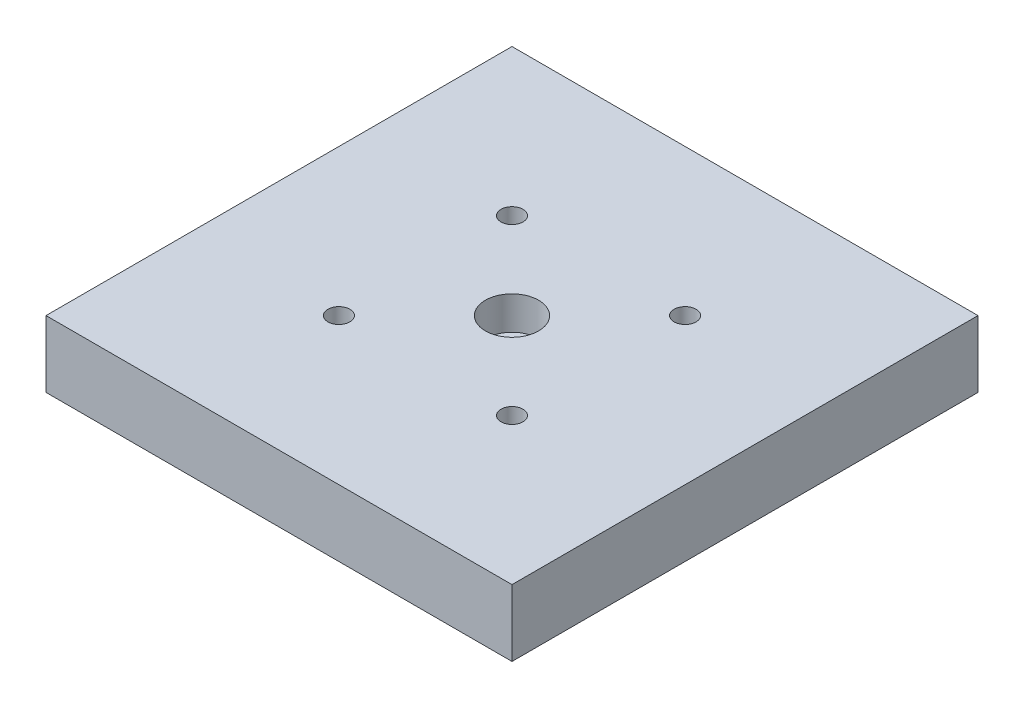
ISO-10303-21;
HEADER;
FILE_DESCRIPTION(('STEP AP214'),'2;1');
FILE_NAME('part.step','',(''),(''),'','','');
FILE_SCHEMA(('AUTOMOTIVE_DESIGN { 1 0 10303 214 1 1 1 1 }'));
ENDSEC;
DATA;
#1=APPLICATION_CONTEXT('core data for automotive mechanical design processes');
#2=APPLICATION_PROTOCOL_DEFINITION('international standard','automotive_design',2000,#1);
#3=PRODUCT_CONTEXT('',#1,'mechanical');
#4=PRODUCT('Part','Part','',(#3));
#5=PRODUCT_RELATED_PRODUCT_CATEGORY('part','',(#4));
#6=PRODUCT_DEFINITION_FORMATION('','',#4);
#7=PRODUCT_DEFINITION_CONTEXT('part definition',#1,'design');
#8=PRODUCT_DEFINITION('design','',#6,#7);
#9=PRODUCT_DEFINITION_SHAPE('','',#8);
#10=(LENGTH_UNIT() NAMED_UNIT(*) SI_UNIT(.MILLI.,.METRE.));
#11=(NAMED_UNIT(*) PLANE_ANGLE_UNIT() SI_UNIT($,.RADIAN.));
#12=(NAMED_UNIT(*) SI_UNIT($,.STERADIAN.) SOLID_ANGLE_UNIT());
#13=UNCERTAINTY_MEASURE_WITH_UNIT(LENGTH_MEASURE(1.E-05),#10,'distance_accuracy_value','');
#14=(GEOMETRIC_REPRESENTATION_CONTEXT(3) GLOBAL_UNCERTAINTY_ASSIGNED_CONTEXT((#13)) GLOBAL_UNIT_ASSIGNED_CONTEXT((#10,
#11,#12)) REPRESENTATION_CONTEXT('',''));
#15=CARTESIAN_POINT('',(0.,0.,0.));
#16=DIRECTION('',(0.,0.,1.));
#17=DIRECTION('',(1.,0.,0.));
#18=AXIS2_PLACEMENT_3D('',#15,#16,#17);
#19=CARTESIAN_POINT('',(35.,10.,35.));
#20=DIRECTION('',(-1.,0.,0.));
#21=DIRECTION('',(0.,0.,1.));
#22=AXIS2_PLACEMENT_3D('',#19,#20,#21);
#23=PLANE('',#22);
#24=DIRECTION('',(0.,0.,-1.));
#25=VECTOR('',#24,1.);
#26=CARTESIAN_POINT('',(35.,0.,35.));
#27=LINE('',#26,#25);
#28=CARTESIAN_POINT('',(35.,0.,35.));
#29=VERTEX_POINT('',#28);
#30=CARTESIAN_POINT('',(35.,0.,-35.));
#31=VERTEX_POINT('',#30);
#32=EDGE_CURVE('E106',#29,#31,#27,.T.);
#33=ORIENTED_EDGE('',*,*,#32,.T.);
#34=DIRECTION('',(0.,-1.,0.));
#35=VECTOR('',#34,1.);
#36=CARTESIAN_POINT('',(35.,10.,-35.));
#37=LINE('',#36,#35);
#38=CARTESIAN_POINT('',(35.,10.,-35.));
#39=VERTEX_POINT('',#38);
#40=EDGE_CURVE('E11',#39,#31,#37,.T.);
#41=ORIENTED_EDGE('',*,*,#40,.F.);
#42=DIRECTION('',(0.,0.,-1.));
#43=VECTOR('',#42,1.);
#44=CARTESIAN_POINT('',(35.,10.,35.));
#45=LINE('',#44,#43);
#46=CARTESIAN_POINT('',(35.,10.,35.));
#47=VERTEX_POINT('',#46);
#48=EDGE_CURVE('E90',#47,#39,#45,.T.);
#49=ORIENTED_EDGE('',*,*,#48,.F.);
#50=DIRECTION('',(0.,-1.,0.));
#51=VECTOR('',#50,1.);
#52=CARTESIAN_POINT('',(35.,10.,35.));
#53=LINE('',#52,#51);
#54=EDGE_CURVE('E102',#47,#29,#53,.T.);
#55=ORIENTED_EDGE('',*,*,#54,.T.);
#56=EDGE_LOOP('',(#33,#41,#49,#55));
#57=FACE_BOUND('',#56,.T.);
#58=ADVANCED_FACE('F38',(#57),#23,.F.);
#59=CARTESIAN_POINT('',(-35.,10.,-35.));
#60=DIRECTION('',(0.,0.,1.));
#61=DIRECTION('',(1.,0.,0.));
#62=AXIS2_PLACEMENT_3D('',#59,#60,#61);
#63=PLANE('',#62);
#64=DIRECTION('',(-1.,0.,0.));
#65=VECTOR('',#64,1.);
#66=CARTESIAN_POINT('',(-35.,0.,-35.));
#67=LINE('',#66,#65);
#68=CARTESIAN_POINT('',(-35.,0.,-35.));
#69=VERTEX_POINT('',#68);
#70=EDGE_CURVE('E95',#31,#69,#67,.T.);
#71=ORIENTED_EDGE('',*,*,#70,.T.);
#72=DIRECTION('',(0.,-1.,0.));
#73=VECTOR('',#72,1.);
#74=CARTESIAN_POINT('',(-35.,10.,-35.));
#75=LINE('',#74,#73);
#76=CARTESIAN_POINT('',(-35.,10.,-35.));
#77=VERTEX_POINT('',#76);
#78=EDGE_CURVE('E47',#77,#69,#75,.T.);
#79=ORIENTED_EDGE('',*,*,#78,.F.);
#80=DIRECTION('',(-1.,0.,0.));
#81=VECTOR('',#80,1.);
#82=CARTESIAN_POINT('',(-35.,10.,-35.));
#83=LINE('',#82,#81);
#84=EDGE_CURVE('E85',#39,#77,#83,.T.);
#85=ORIENTED_EDGE('',*,*,#84,.F.);
#86=ORIENTED_EDGE('',*,*,#40,.T.);
#87=EDGE_LOOP('',(#71,#79,#85,#86));
#88=FACE_BOUND('',#87,.T.);
#89=ADVANCED_FACE('F94',(#88),#63,.F.);
#90=CARTESIAN_POINT('',(-35.,10.,35.));
#91=DIRECTION('',(1.,0.,0.));
#92=DIRECTION('',(0.,0.,-1.));
#93=AXIS2_PLACEMENT_3D('',#90,#91,#92);
#94=PLANE('',#93);
#95=DIRECTION('',(0.,0.,1.));
#96=VECTOR('',#95,1.);
#97=CARTESIAN_POINT('',(-35.,0.,35.));
#98=LINE('',#97,#96);
#99=CARTESIAN_POINT('',(-35.,0.,35.));
#100=VERTEX_POINT('',#99);
#101=EDGE_CURVE('E72',#69,#100,#98,.T.);
#102=ORIENTED_EDGE('',*,*,#101,.T.);
#103=DIRECTION('',(0.,-1.,0.));
#104=VECTOR('',#103,1.);
#105=CARTESIAN_POINT('',(-35.,10.,35.));
#106=LINE('',#105,#104);
#107=CARTESIAN_POINT('',(-35.,10.,35.));
#108=VERTEX_POINT('',#107);
#109=EDGE_CURVE('E97',#108,#100,#106,.T.);
#110=ORIENTED_EDGE('',*,*,#109,.F.);
#111=DIRECTION('',(0.,0.,1.));
#112=VECTOR('',#111,1.);
#113=CARTESIAN_POINT('',(-35.,10.,35.));
#114=LINE('',#113,#112);
#115=EDGE_CURVE('E88',#77,#108,#114,.T.);
#116=ORIENTED_EDGE('',*,*,#115,.F.);
#117=ORIENTED_EDGE('',*,*,#78,.T.);
#118=EDGE_LOOP('',(#102,#110,#116,#117));
#119=FACE_BOUND('',#118,.T.);
#120=ADVANCED_FACE('F98',(#119),#94,.F.);
#121=CARTESIAN_POINT('',(-35.,10.,35.));
#122=DIRECTION('',(0.,0.,-1.));
#123=DIRECTION('',(-1.,0.,0.));
#124=AXIS2_PLACEMENT_3D('',#121,#122,#123);
#125=PLANE('',#124);
#126=DIRECTION('',(1.,0.,0.));
#127=VECTOR('',#126,1.);
#128=CARTESIAN_POINT('',(-35.,0.,35.));
#129=LINE('',#128,#127);
#130=EDGE_CURVE('E78',#100,#29,#129,.T.);
#131=ORIENTED_EDGE('',*,*,#130,.T.);
#132=ORIENTED_EDGE('',*,*,#54,.F.);
#133=DIRECTION('',(1.,0.,0.));
#134=VECTOR('',#133,1.);
#135=CARTESIAN_POINT('',(-35.,10.,35.));
#136=LINE('',#135,#134);
#137=EDGE_CURVE('E55',#108,#47,#136,.T.);
#138=ORIENTED_EDGE('',*,*,#137,.F.);
#139=ORIENTED_EDGE('',*,*,#109,.T.);
#140=EDGE_LOOP('',(#131,#132,#138,#139));
#141=FACE_BOUND('',#140,.T.);
#142=ADVANCED_FACE('F120',(#141),#125,.F.);
#143=CARTESIAN_POINT('',(0.,10.,0.));
#144=DIRECTION('',(0.,-1.,0.));
#145=DIRECTION('',(0.,0.,-1.));
#146=AXIS2_PLACEMENT_3D('',#143,#144,#145);
#147=PLANE('',#146);
#148=CARTESIAN_POINT('',(0.,10.,0.));
#149=DIRECTION('',(0.,1.,0.));
#150=DIRECTION('',(0.,0.,1.));
#151=AXIS2_PLACEMENT_3D('',#148,#149,#150);
#152=CIRCLE('',#151,4.);
#153=CARTESIAN_POINT('',(0.,10.,4.));
#154=VERTEX_POINT('',#153);
#155=EDGE_CURVE('E159',#154,#154,#152,.T.);
#156=ORIENTED_EDGE('',*,*,#155,.F.);
#157=EDGE_LOOP('',(#156));
#158=FACE_BOUND('',#157,.T.);
#159=CARTESIAN_POINT('',(-13.,10.,13.));
#160=DIRECTION('',(0.,1.,0.));
#161=DIRECTION('',(0.,0.,-1.));
#162=AXIS2_PLACEMENT_3D('',#159,#160,#161);
#163=CIRCLE('',#162,1.65);
#164=CARTESIAN_POINT('',(-13.,10.,11.35));
#165=VERTEX_POINT('',#164);
#166=EDGE_CURVE('E135',#165,#165,#163,.T.);
#167=ORIENTED_EDGE('',*,*,#166,.F.);
#168=EDGE_LOOP('',(#167));
#169=FACE_BOUND('',#168,.T.);
#170=CARTESIAN_POINT('',(13.,10.,13.));
#171=DIRECTION('',(0.,1.,0.));
#172=DIRECTION('',(0.,0.,1.));
#173=AXIS2_PLACEMENT_3D('',#170,#171,#172);
#174=CIRCLE('',#173,1.65);
#175=CARTESIAN_POINT('',(13.,10.,14.65));
#176=VERTEX_POINT('',#175);
#177=EDGE_CURVE('E144',#176,#176,#174,.T.);
#178=ORIENTED_EDGE('',*,*,#177,.F.);
#179=EDGE_LOOP('',(#178));
#180=FACE_BOUND('',#179,.T.);
#181=CARTESIAN_POINT('',(13.,10.,-13.));
#182=DIRECTION('',(0.,1.,0.));
#183=DIRECTION('',(0.,0.,-1.));
#184=AXIS2_PLACEMENT_3D('',#181,#182,#183);
#185=CIRCLE('',#184,1.65);
#186=CARTESIAN_POINT('',(13.,10.,-14.65));
#187=VERTEX_POINT('',#186);
#188=EDGE_CURVE('E152',#187,#187,#185,.T.);
#189=ORIENTED_EDGE('',*,*,#188,.F.);
#190=EDGE_LOOP('',(#189));
#191=FACE_BOUND('',#190,.T.);
#192=CARTESIAN_POINT('',(-13.,10.,-13.));
#193=DIRECTION('',(0.,1.,0.));
#194=DIRECTION('',(0.,0.,1.));
#195=AXIS2_PLACEMENT_3D('',#192,#193,#194);
#196=CIRCLE('',#195,1.65);
#197=CARTESIAN_POINT('',(-13.,10.,-11.35));
#198=VERTEX_POINT('',#197);
#199=EDGE_CURVE('E127',#198,#198,#196,.T.);
#200=ORIENTED_EDGE('',*,*,#199,.F.);
#201=EDGE_LOOP('',(#200));
#202=FACE_BOUND('',#201,.T.);
#203=ORIENTED_EDGE('',*,*,#48,.T.);
#204=ORIENTED_EDGE('',*,*,#84,.T.);
#205=ORIENTED_EDGE('',*,*,#115,.T.);
#206=ORIENTED_EDGE('',*,*,#137,.T.);
#207=EDGE_LOOP('',(#203,#204,#205,#206));
#208=FACE_BOUND('',#207,.T.);
#209=ADVANCED_FACE('F86',(#158,#169,#180,#191,#202,#208),#147,.F.);
#210=CARTESIAN_POINT('',(0.,0.,0.));
#211=DIRECTION('',(0.,-1.,0.));
#212=DIRECTION('',(0.,0.,-1.));
#213=AXIS2_PLACEMENT_3D('',#210,#211,#212);
#214=PLANE('',#213);
#215=CARTESIAN_POINT('',(-13.,0.,13.));
#216=DIRECTION('',(0.,1.,0.));
#217=DIRECTION('',(0.,0.,-1.));
#218=AXIS2_PLACEMENT_3D('',#215,#216,#217);
#219=CIRCLE('',#218,1.65);
#220=CARTESIAN_POINT('',(-13.,0.,11.35));
#221=VERTEX_POINT('',#220);
#222=EDGE_CURVE('E139',#221,#221,#219,.T.);
#223=ORIENTED_EDGE('',*,*,#222,.T.);
#224=EDGE_LOOP('',(#223));
#225=FACE_BOUND('',#224,.T.);
#226=CARTESIAN_POINT('',(13.,0.,13.));
#227=DIRECTION('',(0.,1.,0.));
#228=DIRECTION('',(0.,0.,1.));
#229=AXIS2_PLACEMENT_3D('',#226,#227,#228);
#230=CIRCLE('',#229,1.65);
#231=CARTESIAN_POINT('',(13.,0.,14.65));
#232=VERTEX_POINT('',#231);
#233=EDGE_CURVE('E148',#232,#232,#230,.T.);
#234=ORIENTED_EDGE('',*,*,#233,.T.);
#235=EDGE_LOOP('',(#234));
#236=FACE_BOUND('',#235,.T.);
#237=CARTESIAN_POINT('',(13.,0.,-13.));
#238=DIRECTION('',(0.,1.,0.));
#239=DIRECTION('',(0.,0.,-1.));
#240=AXIS2_PLACEMENT_3D('',#237,#238,#239);
#241=CIRCLE('',#240,1.65);
#242=CARTESIAN_POINT('',(13.,0.,-14.65));
#243=VERTEX_POINT('',#242);
#244=EDGE_CURVE('E131',#243,#243,#241,.T.);
#245=ORIENTED_EDGE('',*,*,#244,.T.);
#246=EDGE_LOOP('',(#245));
#247=FACE_BOUND('',#246,.T.);
#248=CARTESIAN_POINT('',(-13.,0.,-13.));
#249=DIRECTION('',(0.,1.,0.));
#250=DIRECTION('',(0.,0.,1.));
#251=AXIS2_PLACEMENT_3D('',#248,#249,#250);
#252=CIRCLE('',#251,1.65);
#253=CARTESIAN_POINT('',(-13.,0.,-11.35));
#254=VERTEX_POINT('',#253);
#255=EDGE_CURVE('E110',#254,#254,#252,.T.);
#256=ORIENTED_EDGE('',*,*,#255,.T.);
#257=EDGE_LOOP('',(#256));
#258=FACE_BOUND('',#257,.T.);
#259=ORIENTED_EDGE('',*,*,#32,.F.);
#260=ORIENTED_EDGE('',*,*,#130,.F.);
#261=ORIENTED_EDGE('',*,*,#101,.F.);
#262=ORIENTED_EDGE('',*,*,#70,.F.);
#263=EDGE_LOOP('',(#259,#260,#261,#262));
#264=FACE_BOUND('',#263,.T.);
#265=ADVANCED_FACE('F123',(#225,#236,#247,#258,#264),#214,.T.);
#266=CARTESIAN_POINT('',(-13.,0.,-13.));
#267=DIRECTION('',(0.,1.,0.));
#268=DIRECTION('',(0.,0.,1.));
#269=AXIS2_PLACEMENT_3D('',#266,#267,#268);
#270=CYLINDRICAL_SURFACE('',#269,1.65);
#271=ORIENTED_EDGE('',*,*,#255,.F.);
#272=EDGE_LOOP('',(#271));
#273=FACE_BOUND('',#272,.T.);
#274=ORIENTED_EDGE('',*,*,#199,.T.);
#275=EDGE_LOOP('',(#274));
#276=FACE_BOUND('',#275,.T.);
#277=ADVANCED_FACE('F187',(#273,#276),#270,.F.);
#278=CARTESIAN_POINT('',(13.,0.,-13.));
#279=DIRECTION('',(0.,1.,0.));
#280=DIRECTION('',(0.,0.,1.));
#281=AXIS2_PLACEMENT_3D('',#278,#279,#280);
#282=CYLINDRICAL_SURFACE('',#281,1.65);
#283=ORIENTED_EDGE('',*,*,#244,.F.);
#284=EDGE_LOOP('',(#283));
#285=FACE_BOUND('',#284,.T.);
#286=ORIENTED_EDGE('',*,*,#188,.T.);
#287=EDGE_LOOP('',(#286));
#288=FACE_BOUND('',#287,.T.);
#289=ADVANCED_FACE('F189',(#285,#288),#282,.F.);
#290=CARTESIAN_POINT('',(13.,0.,13.));
#291=DIRECTION('',(0.,1.,0.));
#292=DIRECTION('',(0.,0.,1.));
#293=AXIS2_PLACEMENT_3D('',#290,#291,#292);
#294=CYLINDRICAL_SURFACE('',#293,1.65);
#295=ORIENTED_EDGE('',*,*,#233,.F.);
#296=EDGE_LOOP('',(#295));
#297=FACE_BOUND('',#296,.T.);
#298=ORIENTED_EDGE('',*,*,#177,.T.);
#299=EDGE_LOOP('',(#298));
#300=FACE_BOUND('',#299,.T.);
#301=ADVANCED_FACE('F196',(#297,#300),#294,.F.);
#302=CARTESIAN_POINT('',(-13.,0.,13.));
#303=DIRECTION('',(0.,1.,0.));
#304=DIRECTION('',(0.,0.,1.));
#305=AXIS2_PLACEMENT_3D('',#302,#303,#304);
#306=CYLINDRICAL_SURFACE('',#305,1.65);
#307=ORIENTED_EDGE('',*,*,#222,.F.);
#308=EDGE_LOOP('',(#307));
#309=FACE_BOUND('',#308,.T.);
#310=ORIENTED_EDGE('',*,*,#166,.T.);
#311=EDGE_LOOP('',(#310));
#312=FACE_BOUND('',#311,.T.);
#313=ADVANCED_FACE('F172',(#309,#312),#306,.F.);
#314=CARTESIAN_POINT('',(0.,5.,0.));
#315=DIRECTION('',(0.,1.,0.));
#316=DIRECTION('',(0.,0.,1.));
#317=AXIS2_PLACEMENT_3D('',#314,#315,#316);
#318=CYLINDRICAL_SURFACE('',#317,4.);
#319=CARTESIAN_POINT('',(0.,5.,0.));
#320=DIRECTION('',(0.,1.,0.));
#321=DIRECTION('',(0.,0.,1.));
#322=AXIS2_PLACEMENT_3D('',#319,#320,#321);
#323=CIRCLE('',#322,4.);
#324=CARTESIAN_POINT('',(0.,5.,4.));
#325=VERTEX_POINT('',#324);
#326=EDGE_CURVE('E140',#325,#325,#323,.T.);
#327=ORIENTED_EDGE('',*,*,#326,.F.);
#328=EDGE_LOOP('',(#327));
#329=FACE_BOUND('',#328,.T.);
#330=ORIENTED_EDGE('',*,*,#155,.T.);
#331=EDGE_LOOP('',(#330));
#332=FACE_BOUND('',#331,.T.);
#333=ADVANCED_FACE('F169',(#329,#332),#318,.F.);
#334=CARTESIAN_POINT('',(0.,5.,0.));
#335=DIRECTION('',(0.,1.,0.));
#336=DIRECTION('',(0.,0.,1.));
#337=AXIS2_PLACEMENT_3D('',#334,#335,#336);
#338=PLANE('',#337);
#339=ORIENTED_EDGE('',*,*,#326,.T.);
#340=EDGE_LOOP('',(#339));
#341=FACE_BOUND('',#340,.T.);
#342=ADVANCED_FACE('F167',(#341),#338,.T.);
#343=CLOSED_SHELL('',(#58,#89,#120,#142,#209,#265,#277,#289,#301,#313,#333,#342));
#344=MANIFOLD_SOLID_BREP('B2',#343);
#345=ADVANCED_BREP_SHAPE_REPRESENTATION('',(#18,#344),#14);
#346=SHAPE_DEFINITION_REPRESENTATION(#9,#345);
ENDSEC;
END-ISO-10303-21;
